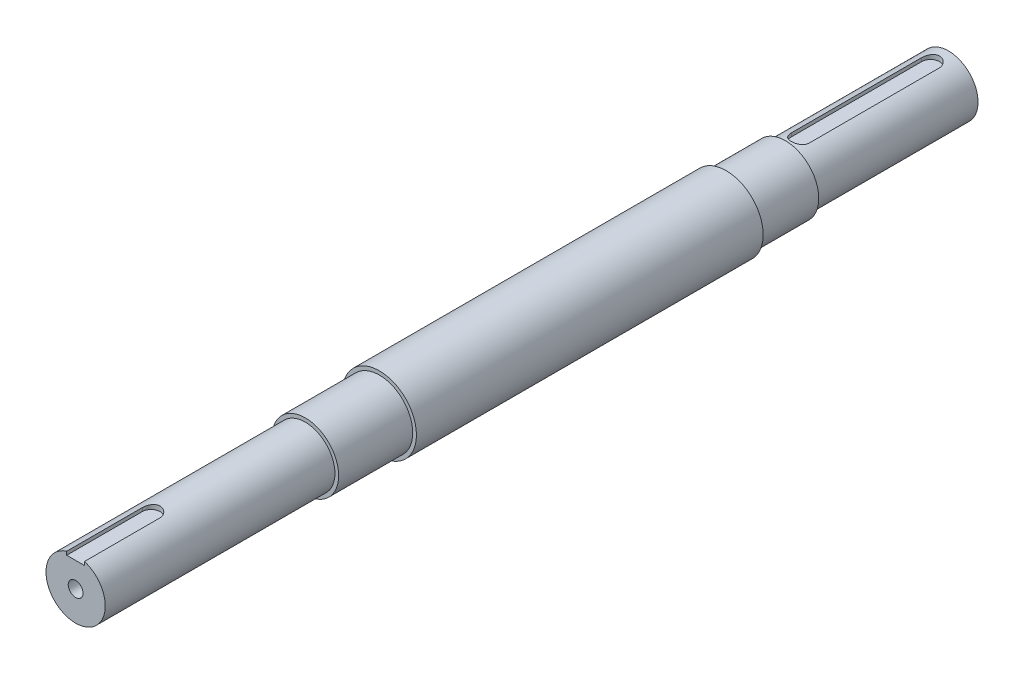
ISO-10303-21;
HEADER;
FILE_DESCRIPTION(('STEP AP214'),'2;1');
FILE_NAME('part.step','',(''),(''),'','','');
FILE_SCHEMA(('AUTOMOTIVE_DESIGN { 1 0 10303 214 1 1 1 1 }'));
ENDSEC;
DATA;
#1=APPLICATION_CONTEXT('core data for automotive mechanical design processes');
#2=APPLICATION_PROTOCOL_DEFINITION('international standard','automotive_design',2000,#1);
#3=PRODUCT_CONTEXT('',#1,'mechanical');
#4=PRODUCT('Part','Part','',(#3));
#5=PRODUCT_RELATED_PRODUCT_CATEGORY('part','',(#4));
#6=PRODUCT_DEFINITION_FORMATION('','',#4);
#7=PRODUCT_DEFINITION_CONTEXT('part definition',#1,'design');
#8=PRODUCT_DEFINITION('design','',#6,#7);
#9=PRODUCT_DEFINITION_SHAPE('','',#8);
#10=(LENGTH_UNIT() NAMED_UNIT(*) SI_UNIT(.MILLI.,.METRE.));
#11=(NAMED_UNIT(*) PLANE_ANGLE_UNIT() SI_UNIT($,.RADIAN.));
#12=(NAMED_UNIT(*) SI_UNIT($,.STERADIAN.) SOLID_ANGLE_UNIT());
#13=UNCERTAINTY_MEASURE_WITH_UNIT(LENGTH_MEASURE(1.E-05),#10,'distance_accuracy_value','');
#14=(GEOMETRIC_REPRESENTATION_CONTEXT(3) GLOBAL_UNCERTAINTY_ASSIGNED_CONTEXT((#13)) GLOBAL_UNIT_ASSIGNED_CONTEXT((#10,
#11,#12)) REPRESENTATION_CONTEXT('',''));
#15=CARTESIAN_POINT('',(0.,0.,0.));
#16=DIRECTION('',(0.,0.,1.));
#17=DIRECTION('',(1.,0.,0.));
#18=AXIS2_PLACEMENT_3D('',#15,#16,#17);
#19=CARTESIAN_POINT('',(0.,0.,234.));
#20=DIRECTION('',(0.,0.,-1.));
#21=DIRECTION('',(-1.,0.,0.));
#22=AXIS2_PLACEMENT_3D('',#19,#20,#21);
#23=CYLINDRICAL_SURFACE('',#22,25.);
#24=CARTESIAN_POINT('',(0.,0.,234.));
#25=DIRECTION('',(0.,0.,1.));
#26=DIRECTION('',(1.,0.,0.));
#27=AXIS2_PLACEMENT_3D('',#24,#25,#26);
#28=CIRCLE('',#27,25.);
#29=CARTESIAN_POINT('',(25.,0.,234.));
#30=VERTEX_POINT('',#29);
#31=EDGE_CURVE('E205',#30,#30,#28,.T.);
#32=ORIENTED_EDGE('',*,*,#31,.F.);
#33=EDGE_LOOP('',(#32));
#34=FACE_BOUND('',#33,.T.);
#35=CARTESIAN_POINT('',(0.,0.,0.));
#36=DIRECTION('',(0.,0.,1.));
#37=DIRECTION('',(1.,0.,0.));
#38=AXIS2_PLACEMENT_3D('',#35,#36,#37);
#39=CIRCLE('',#38,25.);
#40=CARTESIAN_POINT('',(25.,0.,0.));
#41=VERTEX_POINT('',#40);
#42=EDGE_CURVE('E202',#41,#41,#39,.T.);
#43=ORIENTED_EDGE('',*,*,#42,.T.);
#44=EDGE_LOOP('',(#43));
#45=FACE_BOUND('',#44,.T.);
#46=ADVANCED_FACE('F46',(#34,#45),#23,.T.);
#47=CARTESIAN_POINT('',(0.,0.,234.));
#48=DIRECTION('',(0.,0.,1.));
#49=DIRECTION('',(1.,0.,0.));
#50=AXIS2_PLACEMENT_3D('',#47,#48,#49);
#51=PLANE('',#50);
#52=CARTESIAN_POINT('',(0.,0.,234.));
#53=DIRECTION('',(0.,0.,1.));
#54=DIRECTION('',(1.,0.,0.));
#55=AXIS2_PLACEMENT_3D('',#52,#53,#54);
#56=CIRCLE('',#55,22.5);
#57=CARTESIAN_POINT('',(22.5,0.,234.));
#58=VERTEX_POINT('',#57);
#59=EDGE_CURVE('E187',#58,#58,#56,.T.);
#60=ORIENTED_EDGE('',*,*,#59,.F.);
#61=EDGE_LOOP('',(#60));
#62=FACE_BOUND('',#61,.T.);
#63=ORIENTED_EDGE('',*,*,#31,.T.);
#64=EDGE_LOOP('',(#63));
#65=FACE_BOUND('',#64,.T.);
#66=ADVANCED_FACE('F256',(#62,#65),#51,.T.);
#67=CARTESIAN_POINT('',(0.,0.,0.));
#68=DIRECTION('',(0.,0.,1.));
#69=DIRECTION('',(1.,0.,0.));
#70=AXIS2_PLACEMENT_3D('',#67,#68,#69);
#71=PLANE('',#70);
#72=CARTESIAN_POINT('',(0.,0.,0.));
#73=DIRECTION('',(0.,0.,-1.));
#74=DIRECTION('',(-1.,0.,0.));
#75=AXIS2_PLACEMENT_3D('',#72,#73,#74);
#76=CIRCLE('',#75,22.5);
#77=CARTESIAN_POINT('',(-22.5,0.,0.));
#78=VERTEX_POINT('',#77);
#79=EDGE_CURVE('E199',#78,#78,#76,.T.);
#80=ORIENTED_EDGE('',*,*,#79,.F.);
#81=EDGE_LOOP('',(#80));
#82=FACE_BOUND('',#81,.T.);
#83=ORIENTED_EDGE('',*,*,#42,.F.);
#84=EDGE_LOOP('',(#83));
#85=FACE_BOUND('',#84,.T.);
#86=ADVANCED_FACE('F261',(#82,#85),#71,.F.);
#87=CARTESIAN_POINT('',(0.,0.,-40.));
#88=DIRECTION('',(0.,0.,1.));
#89=DIRECTION('',(1.,0.,0.));
#90=AXIS2_PLACEMENT_3D('',#87,#88,#89);
#91=CYLINDRICAL_SURFACE('',#90,22.5);
#92=CARTESIAN_POINT('',(0.,0.,-40.));
#93=DIRECTION('',(0.,0.,-1.));
#94=DIRECTION('',(-1.,0.,0.));
#95=AXIS2_PLACEMENT_3D('',#92,#93,#94);
#96=CIRCLE('',#95,22.5);
#97=CARTESIAN_POINT('',(-22.5,0.,-40.));
#98=VERTEX_POINT('',#97);
#99=EDGE_CURVE('E196',#98,#98,#96,.T.);
#100=ORIENTED_EDGE('',*,*,#99,.F.);
#101=EDGE_LOOP('',(#100));
#102=FACE_BOUND('',#101,.T.);
#103=ORIENTED_EDGE('',*,*,#79,.T.);
#104=EDGE_LOOP('',(#103));
#105=FACE_BOUND('',#104,.T.);
#106=ADVANCED_FACE('F269',(#102,#105),#91,.T.);
#107=CARTESIAN_POINT('',(0.,0.,-40.));
#108=DIRECTION('',(0.,0.,-1.));
#109=DIRECTION('',(-1.,0.,0.));
#110=AXIS2_PLACEMENT_3D('',#107,#108,#109);
#111=PLANE('',#110);
#112=CARTESIAN_POINT('',(0.,0.,-40.));
#113=DIRECTION('',(0.,0.,-1.));
#114=DIRECTION('',(-1.,0.,0.));
#115=AXIS2_PLACEMENT_3D('',#112,#113,#114);
#116=CIRCLE('',#115,20.);
#117=CARTESIAN_POINT('',(-20.,0.,-40.));
#118=VERTEX_POINT('',#117);
#119=EDGE_CURVE('E193',#118,#118,#116,.T.);
#120=ORIENTED_EDGE('',*,*,#119,.F.);
#121=EDGE_LOOP('',(#120));
#122=FACE_BOUND('',#121,.T.);
#123=ORIENTED_EDGE('',*,*,#99,.T.);
#124=EDGE_LOOP('',(#123));
#125=FACE_BOUND('',#124,.T.);
#126=ADVANCED_FACE('F274',(#122,#125),#111,.T.);
#127=CARTESIAN_POINT('',(0.,0.,-150.));
#128=DIRECTION('',(0.,0.,1.));
#129=DIRECTION('',(1.,0.,0.));
#130=AXIS2_PLACEMENT_3D('',#127,#128,#129);
#131=CYLINDRICAL_SURFACE('',#130,20.);
#132=DIRECTION('',(0.,0.,1.));
#133=VECTOR('',#132,1.);
#134=CARTESIAN_POINT('',(6.,19.0787840283388,-150.));
#135=LINE('',#134,#133);
#136=CARTESIAN_POINT('',(6.,19.0787840283388,-138.));
#137=VERTEX_POINT('',#136);
#138=CARTESIAN_POINT('',(6.00000000000001,19.0787840283388,-50.));
#139=VERTEX_POINT('',#138);
#140=EDGE_CURVE('E13',#137,#139,#135,.T.);
#141=ORIENTED_EDGE('',*,*,#140,.T.);
#142=CARTESIAN_POINT('',(6.00000000000001,19.0787840283388,-50.));
#143=CARTESIAN_POINT('',(6.00002230630954,19.0787603919218,-49.8353320050892));
#144=CARTESIAN_POINT('',(5.99322212828862,19.0809150948053,-49.6706726130696));
#145=CARTESIAN_POINT('',(5.96614198358439,19.089408588524,-49.3426105716154));
#146=CARTESIAN_POINT('',(5.94586504749984,19.0957464386677,-49.1792076479863));
#147=CARTESIAN_POINT('',(5.8920645566866,19.1124126760414,-48.8552332063158));
#148=CARTESIAN_POINT('',(5.85857463708938,19.1227309292375,-48.6946555720362));
#149=CARTESIAN_POINT('',(5.77865096251379,19.1470349488515,-48.3770376913315));
#150=CARTESIAN_POINT('',(5.73221686903432,19.1610208111801,-48.2199975375307));
#151=CARTESIAN_POINT('',(5.62682620459485,19.1922338155173,-47.9106174392765));
#152=CARTESIAN_POINT('',(5.56787702452554,19.2094590438083,-47.7582747812241));
#153=CARTESIAN_POINT('',(5.43788252899625,19.2466621419291,-47.4591258570984));
#154=CARTESIAN_POINT('',(5.36683271334058,19.2666410353108,-47.3123216756719));
#155=CARTESIAN_POINT('',(5.21317247195195,19.3087849542851,-47.0252150547469));
#156=CARTESIAN_POINT('',(5.13056139609833,19.3309501027959,-46.8849129814703));
#157=CARTESIAN_POINT('',(4.95431913401974,19.3768680311909,-46.6116122013252));
#158=CARTESIAN_POINT('',(4.86068378223772,19.4006214097184,-46.4786162831277));
#159=CARTESIAN_POINT('',(4.66024014290224,19.4497584548899,-46.2171364267704));
#160=CARTESIAN_POINT('',(4.5531352636269,19.4751691904069,-46.0888848478018));
#161=CARTESIAN_POINT('',(4.32860344600267,19.5263015189751,-45.8417460629913));
#162=CARTESIAN_POINT('',(4.21117292654719,19.5520232171847,-45.7228621333289));
#163=CARTESIAN_POINT('',(3.96676059198593,19.6030710031715,-45.4952586048781));
#164=CARTESIAN_POINT('',(3.8397787187394,19.6283970885393,-45.3865390679712));
#165=CARTESIAN_POINT('',(3.57705696576212,19.6779706962222,-45.1799807455275));
#166=CARTESIAN_POINT('',(3.4413171551297,19.7022182270442,-45.082141874161));
#167=CARTESIAN_POINT('',(3.15899953964078,19.749471573422,-44.8960902317401));
#168=CARTESIAN_POINT('',(3.01225429870655,19.7724407517412,-44.8081219536975));
#169=CARTESIAN_POINT('',(2.71155717798054,19.8159158974823,-44.644936205945));
#170=CARTESIAN_POINT('',(2.55760798995098,19.8364227748921,-44.569714021433));
#171=CARTESIAN_POINT('',(2.24348996032484,19.8744001644265,-44.4325835606286));
#172=CARTESIAN_POINT('',(2.08331997555621,19.8918701152059,-44.3706777452318));
#173=CARTESIAN_POINT('',(1.75801430484775,19.923254535561,-44.2607624975442));
#174=CARTESIAN_POINT('',(1.5928807989739,19.9371705413064,-44.2127470600318));
#175=CARTESIAN_POINT('',(1.26354510595575,19.9607097696429,-44.1321744532723));
#176=CARTESIAN_POINT('',(1.0994480892508,19.9704430293701,-44.0992193730418));
#177=CARTESIAN_POINT('',(0.768952154148966,19.9858966495547,-44.0471280027136));
#178=CARTESIAN_POINT('',(0.60255418179931,19.9916186120195,-44.0279861958654));
#179=CARTESIAN_POINT('',(0.268644299740245,19.9988929276978,-44.0036800351431));
#180=CARTESIAN_POINT('',(0.101132356360992,20.0004451543012,-43.9985161056939));
#181=CARTESIAN_POINT('',(-0.233720900410843,19.9993350985709,-44.0022164050785));
#182=CARTESIAN_POINT('',(-0.401062216878486,19.9966728935832,-44.0110803764628));
#183=CARTESIAN_POINT('',(-0.72894994040029,19.9873626800315,-44.0422422116024));
#184=CARTESIAN_POINT('',(-0.889542117296633,19.9808452710305,-44.0641000099827));
#185=CARTESIAN_POINT('',(-1.20830021014904,19.9641050678088,-44.1206954817583));
#186=CARTESIAN_POINT('',(-1.36646528055413,19.9538810115069,-44.1554375422251));
#187=CARTESIAN_POINT('',(-1.67917461818936,19.9300014175933,-44.2374923016098));
#188=CARTESIAN_POINT('',(-1.83372008335729,19.916347033335,-44.2848007757229));
#189=CARTESIAN_POINT('',(-2.13828018933732,19.8859545815151,-44.3916302710632));
#190=CARTESIAN_POINT('',(-2.28829310223868,19.8692153547843,-44.4511558839967));
#191=CARTESIAN_POINT('',(-2.5844350788094,19.8328818557961,-44.5826905795393));
#192=CARTESIAN_POINT('',(-2.73050124822118,19.8132575095082,-44.6548328971983));
#193=CARTESIAN_POINT('',(-3.01609632375418,19.7717979578185,-44.8106231473294));
#194=CARTESIAN_POINT('',(-3.15562296424239,19.7499619943591,-44.8942750283841));
#195=CARTESIAN_POINT('',(-3.42724384686889,19.704643118031,-45.0724869824413));
#196=CARTESIAN_POINT('',(-3.55933800314024,19.6811601861419,-45.1670471814283));
#197=CARTESIAN_POINT('',(-3.81531376455354,19.6331439703208,-45.3664586784288));
#198=CARTESIAN_POINT('',(-3.93919513006482,19.6086106557753,-45.4713102765009));
#199=CARTESIAN_POINT('',(-4.18263653591651,19.5581593507452,-45.6948972434632));
#200=CARTESIAN_POINT('',(-4.30184428600932,19.5322244988475,-45.8140126794742));
#201=CARTESIAN_POINT('',(-4.52981041510265,19.4806179410542,-46.0618335035024));
#202=CARTESIAN_POINT('',(-4.63857214120813,19.454946153239,-46.1905357960809));
#203=CARTESIAN_POINT('',(-4.84504126060964,19.4045581786368,-46.4568403962384));
#204=CARTESIAN_POINT('',(-4.94274124635231,19.3798426394128,-46.5944485719006));
#205=CARTESIAN_POINT('',(-5.12628631686322,19.3321023379674,-46.8775590923328));
#206=CARTESIAN_POINT('',(-5.21213600998875,19.3090769201297,-47.0230583375784));
#207=CARTESIAN_POINT('',(-5.37223080367564,19.2651525602885,-47.3226351350932));
#208=CARTESIAN_POINT('',(-5.446343714374,19.2442786555291,-47.476787078659));
#209=CARTESIAN_POINT('',(-5.58122691640502,19.2055937237889,-47.7911218413611));
#210=CARTESIAN_POINT('',(-5.64200266456202,19.1877814448102,-47.9513021624776));
#211=CARTESIAN_POINT('',(-5.7496614534963,19.1557967477957,-48.2764321183499));
#212=CARTESIAN_POINT('',(-5.79655912825486,19.1416204978023,-48.4413765265628));
#213=CARTESIAN_POINT('',(-5.87609462586437,19.1173543231183,-48.774893180451));
#214=CARTESIAN_POINT('',(-5.90873902604376,19.1072625137754,-48.9434637150485));
#215=CARTESIAN_POINT('',(-5.956031317324,19.0925703406668,-49.2599370702365));
#216=CARTESIAN_POINT('',(-5.97251971262424,19.0874107715083,-49.40754170936));
#217=CARTESIAN_POINT('',(-5.99450261914155,19.0805126306352,-49.7034271124753));
#218=CARTESIAN_POINT('',(-6.00001329545507,19.0787690288453,-49.8517065595746));
#219=CARTESIAN_POINT('',(-5.99999999999999,19.0787840283388,-50.));
#220=B_SPLINE_CURVE_WITH_KNOTS('',3,(#142,#143,#144,#145,#146,#147,#148,#149,#150,#151,#152,
#153,#154,#155,#156,#157,#158,#159,#160,#161,#162,#163,#164,#165,#166,#167,#168,#169,#170,#171,
#172,#173,#174,#175,#176,#177,#178,#179,#180,#181,#182,#183,#184,#185,#186,#187,#188,#189,#190,
#191,#192,#193,#194,#195,#196,#197,#198,#199,#200,#201,#202,#203,#204,#205,#206,#207,#208,#209,
#210,#211,#212,#213,#214,#215,#216,#217,#218,#219),.UNSPECIFIED.,.F.,.F.,(4,2,2,2,2,2,2,2,2,2,2,
2,2,2,2,2,2,2,2,2,2,2,2,2,2,2,2,2,2,2,2,2,2,2,2,2,2,2,4),(0.,0.493836284878935,
0.987561555412167,1.48003801924603,1.97252736296405,2.4647266679518,2.95710942192587,
3.44951987503683,3.94211698773001,4.44857898474592,4.95521732942466,5.46185875834845,
5.96849619046394,6.48574341264193,7.00279888450883,7.51994982748058,8.03687685551443,
8.53921958328377,9.04136157401788,9.54351881163819,10.0456668334346,10.5317065218739,
11.0179118582603,11.5039539397551,11.9901790315928,12.4818885441265,12.9737671698834,
13.4656514771114,13.9575501300996,14.4684682486942,14.9792221093922,15.4903160010787,
16.001210574562,16.517502934493,17.0335836608614,17.549118241575,18.0644146711719,
18.509813123396,18.9545552237083),.UNSPECIFIED.);
#221=CARTESIAN_POINT('',(-5.99999999999999,19.0787840283388,-50.));
#222=VERTEX_POINT('',#221);
#223=EDGE_CURVE('E221',#139,#222,#220,.T.);
#224=ORIENTED_EDGE('',*,*,#223,.T.);
#225=DIRECTION('',(0.,0.,1.));
#226=VECTOR('',#225,1.);
#227=CARTESIAN_POINT('',(-6.,19.0787840283388,-150.));
#228=LINE('',#227,#226);
#229=CARTESIAN_POINT('',(-6.,19.0787840283388,-138.));
#230=VERTEX_POINT('',#229);
#231=EDGE_CURVE('E53',#222,#230,#228,.F.);
#232=ORIENTED_EDGE('',*,*,#231,.T.);
#233=CARTESIAN_POINT('',(-6.,19.0787840283388,-138.));
#234=CARTESIAN_POINT('',(-6.00002230630954,19.0787603919218,-138.164667994911));
#235=CARTESIAN_POINT('',(-5.99322212828861,19.0809150948054,-138.32932738693));
#236=CARTESIAN_POINT('',(-5.96614198358438,19.089408588524,-138.657389428385));
#237=CARTESIAN_POINT('',(-5.94586504749982,19.0957464386677,-138.820792352014));
#238=CARTESIAN_POINT('',(-5.89206455668658,19.1124126760415,-139.144766793684));
#239=CARTESIAN_POINT('',(-5.85857463708937,19.1227309292375,-139.305344427964));
#240=CARTESIAN_POINT('',(-5.77865096251377,19.1470349488515,-139.622962308668));
#241=CARTESIAN_POINT('',(-5.73221686903431,19.1610208111801,-139.780002462469));
#242=CARTESIAN_POINT('',(-5.62682620459483,19.1922338155173,-140.089382560724));
#243=CARTESIAN_POINT('',(-5.56787702452552,19.2094590438083,-140.241725218776));
#244=CARTESIAN_POINT('',(-5.43788252899623,19.2466621419291,-140.540874142902));
#245=CARTESIAN_POINT('',(-5.36683271334056,19.2666410353108,-140.687678324328));
#246=CARTESIAN_POINT('',(-5.21317247195194,19.3087849542851,-140.974784945253));
#247=CARTESIAN_POINT('',(-5.13056139609832,19.3309501027959,-141.11508701853));
#248=CARTESIAN_POINT('',(-4.95431913401973,19.3768680311909,-141.388387798675));
#249=CARTESIAN_POINT('',(-4.86068378223771,19.4006214097184,-141.521383716872));
#250=CARTESIAN_POINT('',(-4.66024014290224,19.4497584548899,-141.78286357323));
#251=CARTESIAN_POINT('',(-4.5531352636269,19.4751691904069,-141.911115152198));
#252=CARTESIAN_POINT('',(-4.32860344600267,19.5263015189751,-142.158253937009));
#253=CARTESIAN_POINT('',(-4.21117292654719,19.5520232171847,-142.277137866671));
#254=CARTESIAN_POINT('',(-3.96676059198593,19.6030710031715,-142.504741395122));
#255=CARTESIAN_POINT('',(-3.8397787187394,19.6283970885393,-142.613460932029));
#256=CARTESIAN_POINT('',(-3.57705696576211,19.6779706962222,-142.820019254472));
#257=CARTESIAN_POINT('',(-3.44131715512969,19.7022182270442,-142.917858125839));
#258=CARTESIAN_POINT('',(-3.15899953964076,19.749471573422,-143.10390976826));
#259=CARTESIAN_POINT('',(-3.01225429870653,19.7724407517412,-143.191878046302));
#260=CARTESIAN_POINT('',(-2.71155717798052,19.8159158974823,-143.355063794055));
#261=CARTESIAN_POINT('',(-2.55760798995096,19.8364227748921,-143.430285978567));
#262=CARTESIAN_POINT('',(-2.24348996032481,19.8744001644265,-143.567416439371));
#263=CARTESIAN_POINT('',(-2.08331997555618,19.8918701152059,-143.629322254768));
#264=CARTESIAN_POINT('',(-1.75801430484772,19.9232545355611,-143.739237502456));
#265=CARTESIAN_POINT('',(-1.59288079897389,19.9371705413067,-143.787252939968));
#266=CARTESIAN_POINT('',(-1.26354510595574,19.9607097696431,-143.867825546728));
#267=CARTESIAN_POINT('',(-1.09944808925078,19.9704430293702,-143.900780626958));
#268=CARTESIAN_POINT('',(-0.768952154148942,19.9858966495547,-143.952871997286));
#269=CARTESIAN_POINT('',(-0.60255418179929,19.9916186120195,-143.972013804135));
#270=CARTESIAN_POINT('',(-0.268644299740226,19.9988929276978,-143.996319964857));
#271=CARTESIAN_POINT('',(-0.10113235636097,20.0004451543012,-144.001483894306));
#272=CARTESIAN_POINT('',(0.233720900410867,19.9993350985709,-143.997783594921));
#273=CARTESIAN_POINT('',(0.40106221687851,19.9966728935832,-143.988919623537));
#274=CARTESIAN_POINT('',(0.728949940400316,19.9873626800315,-143.957757788398));
#275=CARTESIAN_POINT('',(0.889542117296662,19.9808452710305,-143.935899990017));
#276=CARTESIAN_POINT('',(1.20830021014907,19.9641050678088,-143.879304518242));
#277=CARTESIAN_POINT('',(1.36646528055415,19.9538810115069,-143.844562457775));
#278=CARTESIAN_POINT('',(1.67917461818938,19.9300014175933,-143.76250769839));
#279=CARTESIAN_POINT('',(1.83372008335732,19.9163470333349,-143.715199224277));
#280=CARTESIAN_POINT('',(2.13828018933735,19.8859545815151,-143.608369728937));
#281=CARTESIAN_POINT('',(2.28829310223871,19.8692153547843,-143.548844116003));
#282=CARTESIAN_POINT('',(2.58443507880942,19.8328818557961,-143.417309420461));
#283=CARTESIAN_POINT('',(2.7305012482212,19.8132575095082,-143.345167102802));
#284=CARTESIAN_POINT('',(3.0160963237542,19.7717979578185,-143.189376852671));
#285=CARTESIAN_POINT('',(3.15562296424241,19.7499619943591,-143.105724971616));
#286=CARTESIAN_POINT('',(3.42724384686891,19.704643118031,-142.927513017559));
#287=CARTESIAN_POINT('',(3.55933800314026,19.6811601861419,-142.832952818572));
#288=CARTESIAN_POINT('',(3.81531376455355,19.6331439703208,-142.633541321571));
#289=CARTESIAN_POINT('',(3.93919513006484,19.6086106557753,-142.528689723499));
#290=CARTESIAN_POINT('',(4.18263653591652,19.5581593507452,-142.305102756537));
#291=CARTESIAN_POINT('',(4.30184428600934,19.5322244988475,-142.185987320526));
#292=CARTESIAN_POINT('',(4.52981041510267,19.4806179410542,-141.938166496498));
#293=CARTESIAN_POINT('',(4.63857214120815,19.454946153239,-141.809464203919));
#294=CARTESIAN_POINT('',(4.84504126060965,19.4045581786368,-141.543159603762));
#295=CARTESIAN_POINT('',(4.94274124635232,19.3798426394128,-141.405551428099));
#296=CARTESIAN_POINT('',(5.12628631686323,19.3321023379674,-141.122440907667));
#297=CARTESIAN_POINT('',(5.21213600998877,19.3090769201297,-140.976941662422));
#298=CARTESIAN_POINT('',(5.37223080367565,19.2651525602885,-140.677364864907));
#299=CARTESIAN_POINT('',(5.44634371437402,19.2442786555291,-140.523212921341));
#300=CARTESIAN_POINT('',(5.58122691640503,19.2055937237889,-140.208878158639));
#301=CARTESIAN_POINT('',(5.64200266456203,19.1877814448102,-140.048697837522));
#302=CARTESIAN_POINT('',(5.74966145349631,19.1557967477957,-139.72356788165));
#303=CARTESIAN_POINT('',(5.79655912825487,19.1416204978023,-139.558623473437));
#304=CARTESIAN_POINT('',(5.87609462586438,19.1173543231183,-139.225106819549));
#305=CARTESIAN_POINT('',(5.90873902604377,19.1072625137754,-139.056536284951));
#306=CARTESIAN_POINT('',(5.95603131732401,19.0925703406668,-138.740062929764));
#307=CARTESIAN_POINT('',(5.97251971262425,19.0874107715083,-138.59245829064));
#308=CARTESIAN_POINT('',(5.99450261914155,19.0805126306352,-138.296572887525));
#309=CARTESIAN_POINT('',(6.00001329545508,19.0787690288453,-138.148293440425));
#310=CARTESIAN_POINT('',(6.,19.0787840283388,-138.));
#311=B_SPLINE_CURVE_WITH_KNOTS('',3,(#233,#234,#235,#236,#237,#238,#239,#240,#241,#242,#243,
#244,#245,#246,#247,#248,#249,#250,#251,#252,#253,#254,#255,#256,#257,#258,#259,#260,#261,#262,
#263,#264,#265,#266,#267,#268,#269,#270,#271,#272,#273,#274,#275,#276,#277,#278,#279,#280,#281,
#282,#283,#284,#285,#286,#287,#288,#289,#290,#291,#292,#293,#294,#295,#296,#297,#298,#299,#300,
#301,#302,#303,#304,#305,#306,#307,#308,#309,#310),.UNSPECIFIED.,.F.,.F.,(4,2,2,2,2,2,2,2,2,2,2,
2,2,2,2,2,2,2,2,2,2,2,2,2,2,2,2,2,2,2,2,2,2,2,2,2,2,2,4),(0.,0.493836284878977,
0.987561555412217,1.48003801924605,1.97252736296405,2.46472666795184,2.95710942192589,
3.44951987503686,3.94211698773,4.44857898474589,4.95521732942464,5.46185875834845,
5.96849619046394,6.48574341264194,7.00279888450884,7.5199498274806,8.03687685551446,
8.53921958328379,9.04136157401789,9.54351881163821,10.0456668334346,10.531706521874,
11.0179118582603,11.5039539397552,11.9901790315928,12.4818885441265,12.9737671698834,
13.4656514771114,13.9575501300996,14.4684682486943,14.9792221093922,15.4903160010787,
16.001210574562,16.5175029344931,17.0335836608614,17.549118241575,18.0644146711719,
18.509813123396,18.9545552237083),.UNSPECIFIED.);
#312=EDGE_CURVE('E60',#230,#137,#311,.T.);
#313=ORIENTED_EDGE('',*,*,#312,.T.);
#314=EDGE_LOOP('',(#141,#224,#232,#313));
#315=FACE_BOUND('',#314,.T.);
#316=CARTESIAN_POINT('',(0.,0.,-150.));
#317=DIRECTION('',(0.,0.,-1.));
#318=DIRECTION('',(-1.,0.,0.));
#319=AXIS2_PLACEMENT_3D('',#316,#317,#318);
#320=CIRCLE('',#319,20.);
#321=CARTESIAN_POINT('',(-20.,0.,-150.));
#322=VERTEX_POINT('',#321);
#323=EDGE_CURVE('E190',#322,#322,#320,.T.);
#324=ORIENTED_EDGE('',*,*,#323,.F.);
#325=EDGE_LOOP('',(#324));
#326=FACE_BOUND('',#325,.T.);
#327=ORIENTED_EDGE('',*,*,#119,.T.);
#328=EDGE_LOOP('',(#327));
#329=FACE_BOUND('',#328,.T.);
#330=ADVANCED_FACE('F280',(#315,#326,#329),#131,.T.);
#331=CARTESIAN_POINT('',(0.,0.,-150.));
#332=DIRECTION('',(0.,0.,-1.));
#333=DIRECTION('',(-1.,0.,0.));
#334=AXIS2_PLACEMENT_3D('',#331,#332,#333);
#335=PLANE('',#334);
#336=CARTESIAN_POINT('',(0.,0.,-150.));
#337=DIRECTION('',(0.,0.,-1.));
#338=DIRECTION('',(-1.,0.,0.));
#339=AXIS2_PLACEMENT_3D('',#336,#337,#338);
#340=CIRCLE('',#339,4.99999999999999);
#341=CARTESIAN_POINT('',(-4.99999999999999,0.,-150.));
#342=VERTEX_POINT('',#341);
#343=EDGE_CURVE('E124',#342,#342,#340,.T.);
#344=ORIENTED_EDGE('',*,*,#343,.F.);
#345=EDGE_LOOP('',(#344));
#346=FACE_BOUND('',#345,.T.);
#347=ORIENTED_EDGE('',*,*,#323,.T.);
#348=EDGE_LOOP('',(#347));
#349=FACE_BOUND('',#348,.T.);
#350=ADVANCED_FACE('F285',(#346,#349),#335,.T.);
#351=CARTESIAN_POINT('',(0.,0.,284.));
#352=DIRECTION('',(0.,0.,-1.));
#353=DIRECTION('',(-1.,0.,0.));
#354=AXIS2_PLACEMENT_3D('',#351,#352,#353);
#355=CYLINDRICAL_SURFACE('',#354,22.5);
#356=CARTESIAN_POINT('',(0.,0.,284.));
#357=DIRECTION('',(0.,0.,1.));
#358=DIRECTION('',(1.,0.,0.));
#359=AXIS2_PLACEMENT_3D('',#356,#357,#358);
#360=CIRCLE('',#359,22.5);
#361=CARTESIAN_POINT('',(22.5,0.,284.));
#362=VERTEX_POINT('',#361);
#363=EDGE_CURVE('E182',#362,#362,#360,.T.);
#364=ORIENTED_EDGE('',*,*,#363,.F.);
#365=EDGE_LOOP('',(#364));
#366=FACE_BOUND('',#365,.T.);
#367=ORIENTED_EDGE('',*,*,#59,.T.);
#368=EDGE_LOOP('',(#367));
#369=FACE_BOUND('',#368,.T.);
#370=ADVANCED_FACE('F385',(#366,#369),#355,.T.);
#371=CARTESIAN_POINT('',(0.,0.,284.));
#372=DIRECTION('',(0.,0.,1.));
#373=DIRECTION('',(1.,0.,0.));
#374=AXIS2_PLACEMENT_3D('',#371,#372,#373);
#375=PLANE('',#374);
#376=CARTESIAN_POINT('',(0.,0.,284.));
#377=DIRECTION('',(0.,0.,1.));
#378=DIRECTION('',(1.,0.,0.));
#379=AXIS2_PLACEMENT_3D('',#376,#377,#378);
#380=CIRCLE('',#379,20.);
#381=CARTESIAN_POINT('',(20.,0.,284.));
#382=VERTEX_POINT('',#381);
#383=EDGE_CURVE('E183',#382,#382,#380,.T.);
#384=ORIENTED_EDGE('',*,*,#383,.F.);
#385=EDGE_LOOP('',(#384));
#386=FACE_BOUND('',#385,.T.);
#387=ORIENTED_EDGE('',*,*,#363,.T.);
#388=EDGE_LOOP('',(#387));
#389=FACE_BOUND('',#388,.T.);
#390=ADVANCED_FACE('F251',(#386,#389),#375,.T.);
#391=CARTESIAN_POINT('',(0.,0.,439.));
#392=DIRECTION('',(0.,0.,-1.));
#393=DIRECTION('',(-1.,0.,0.));
#394=AXIS2_PLACEMENT_3D('',#391,#392,#393);
#395=CYLINDRICAL_SURFACE('',#394,20.);
#396=CARTESIAN_POINT('',(0.,0.,439.));
#397=DIRECTION('',(0.,0.,1.));
#398=DIRECTION('',(1.,0.,0.));
#399=AXIS2_PLACEMENT_3D('',#396,#397,#398);
#400=CIRCLE('',#399,20.);
#401=CARTESIAN_POINT('',(-6.,19.0787840283388,439.));
#402=VERTEX_POINT('',#401);
#403=CARTESIAN_POINT('',(6.,19.0787840283388,439.));
#404=VERTEX_POINT('',#403);
#405=EDGE_CURVE('E179',#402,#404,#400,.T.);
#406=ORIENTED_EDGE('',*,*,#405,.F.);
#407=DIRECTION('',(0.,0.,-1.));
#408=VECTOR('',#407,1.);
#409=CARTESIAN_POINT('',(-6.,19.0787840283388,439.));
#410=LINE('',#409,#408);
#411=CARTESIAN_POINT('',(-6.,19.0787840283388,388.));
#412=VERTEX_POINT('',#411);
#413=EDGE_CURVE('E176',#402,#412,#410,.T.);
#414=ORIENTED_EDGE('',*,*,#413,.T.);
#415=CARTESIAN_POINT('',(-6.,19.0787840283388,388.));
#416=CARTESIAN_POINT('',(-6.00002230630954,19.0787603919218,387.835332005089));
#417=CARTESIAN_POINT('',(-5.99322212828861,19.0809150948053,387.67067261307));
#418=CARTESIAN_POINT('',(-5.96614198358439,19.089408588524,387.342610571616));
#419=CARTESIAN_POINT('',(-5.94586504749983,19.0957464386677,387.179207647986));
#420=CARTESIAN_POINT('',(-5.89206455668659,19.1124126760414,386.855233206316));
#421=CARTESIAN_POINT('',(-5.85857463708937,19.1227309292375,386.694655572036));
#422=CARTESIAN_POINT('',(-5.77865096251378,19.1470349488515,386.377037691332));
#423=CARTESIAN_POINT('',(-5.73221686903432,19.1610208111801,386.219997537531));
#424=CARTESIAN_POINT('',(-5.62682620459485,19.1922338155173,385.910617439277));
#425=CARTESIAN_POINT('',(-5.56787702452554,19.2094590438083,385.758274781224));
#426=CARTESIAN_POINT('',(-5.43788252899627,19.2466621419291,385.459125857099));
#427=CARTESIAN_POINT('',(-5.36683271334059,19.2666410353108,385.312321675672));
#428=CARTESIAN_POINT('',(-5.21317247195197,19.3087849542851,385.025215054747));
#429=CARTESIAN_POINT('',(-5.13056139609835,19.3309501027959,384.88491298147));
#430=CARTESIAN_POINT('',(-4.95431913401975,19.3768680311909,384.611612201325));
#431=CARTESIAN_POINT('',(-4.86068378223773,19.4006214097184,384.478616283128));
#432=CARTESIAN_POINT('',(-4.66024014290223,19.4497584548899,384.21713642677));
#433=CARTESIAN_POINT('',(-4.55313526362689,19.4751691904069,384.088884847802));
#434=CARTESIAN_POINT('',(-4.32860344600265,19.5263015189751,383.841746062991));
#435=CARTESIAN_POINT('',(-4.21117292654718,19.5520232171847,383.722862133329));
#436=CARTESIAN_POINT('',(-3.96676059198592,19.6030710031715,383.495258604878));
#437=CARTESIAN_POINT('',(-3.83977871873939,19.6283970885393,383.386539067971));
#438=CARTESIAN_POINT('',(-3.57705696576211,19.6779706962222,383.179980745528));
#439=CARTESIAN_POINT('',(-3.4413171551297,19.7022182270442,383.082141874161));
#440=CARTESIAN_POINT('',(-3.15899953964078,19.749471573422,382.89609023174));
#441=CARTESIAN_POINT('',(-3.01225429870655,19.7724407517412,382.808121953698));
#442=CARTESIAN_POINT('',(-2.71155717798054,19.8159158974823,382.644936205945));
#443=CARTESIAN_POINT('',(-2.55760798995098,19.8364227748921,382.569714021433));
#444=CARTESIAN_POINT('',(-2.24348996032483,19.8744001644265,382.432583560629));
#445=CARTESIAN_POINT('',(-2.0833199755562,19.8918701152059,382.370677745232));
#446=CARTESIAN_POINT('',(-1.75801430484774,19.923254535561,382.260762497544));
#447=CARTESIAN_POINT('',(-1.5928807989739,19.9371705413064,382.212747060032));
#448=CARTESIAN_POINT('',(-1.26354510595575,19.9607097696429,382.132174453272));
#449=CARTESIAN_POINT('',(-1.09944808925079,19.9704430293701,382.099219373042));
#450=CARTESIAN_POINT('',(-0.768952154148962,19.9858966495547,382.047128002714));
#451=CARTESIAN_POINT('',(-0.602554181799306,19.9916186120195,382.027986195865));
#452=CARTESIAN_POINT('',(-0.268644299740244,19.9988929276978,382.003680035143));
#453=CARTESIAN_POINT('',(-0.101132356360993,20.0004451543012,381.998516105694));
#454=CARTESIAN_POINT('',(0.233720900410838,19.9993350985709,382.002216405079));
#455=CARTESIAN_POINT('',(0.40106221687848,19.9966728935832,382.011080376463));
#456=CARTESIAN_POINT('',(0.728949940400284,19.9873626800315,382.042242211603));
#457=CARTESIAN_POINT('',(0.88954211729663,19.9808452710305,382.064100009983));
#458=CARTESIAN_POINT('',(1.20830021014903,19.9641050678088,382.120695481758));
#459=CARTESIAN_POINT('',(1.36646528055412,19.9538810115069,382.155437542225));
#460=CARTESIAN_POINT('',(1.67917461818934,19.9300014175933,382.23749230161));
#461=CARTESIAN_POINT('',(1.83372008335727,19.916347033335,382.284800775723));
#462=CARTESIAN_POINT('',(2.1382801893373,19.8859545815151,382.391630271063));
#463=CARTESIAN_POINT('',(2.28829310223867,19.8692153547843,382.451155883997));
#464=CARTESIAN_POINT('',(2.58443507880938,19.8328818557961,382.582690579539));
#465=CARTESIAN_POINT('',(2.73050124822115,19.8132575095082,382.654832897198));
#466=CARTESIAN_POINT('',(3.01609632375415,19.7717979578185,382.81062314733));
#467=CARTESIAN_POINT('',(3.15562296424237,19.7499619943591,382.894275028384));
#468=CARTESIAN_POINT('',(3.42724384686888,19.704643118031,383.072486982441));
#469=CARTESIAN_POINT('',(3.55933800314023,19.6811601861419,383.167047181428));
#470=CARTESIAN_POINT('',(3.81531376455352,19.6331439703208,383.366458678429));
#471=CARTESIAN_POINT('',(3.93919513006481,19.6086106557753,383.471310276501));
#472=CARTESIAN_POINT('',(4.1826365359165,19.5581593507452,383.694897243463));
#473=CARTESIAN_POINT('',(4.30184428600932,19.5322244988475,383.814012679474));
#474=CARTESIAN_POINT('',(4.52981041510265,19.4806179410542,384.061833503502));
#475=CARTESIAN_POINT('',(4.63857214120814,19.454946153239,384.190535796081));
#476=CARTESIAN_POINT('',(4.84504126060964,19.4045581786368,384.456840396239));
#477=CARTESIAN_POINT('',(4.94274124635231,19.3798426394128,384.594448571901));
#478=CARTESIAN_POINT('',(5.12628631686323,19.3321023379674,384.877559092333));
#479=CARTESIAN_POINT('',(5.21213600998877,19.3090769201297,385.023058337579));
#480=CARTESIAN_POINT('',(5.37223080367565,19.2651525602885,385.322635135093));
#481=CARTESIAN_POINT('',(5.44634371437401,19.2442786555291,385.476787078659));
#482=CARTESIAN_POINT('',(5.58122691640502,19.2055937237889,385.791121841361));
#483=CARTESIAN_POINT('',(5.64200266456202,19.1877814448102,385.951302162478));
#484=CARTESIAN_POINT('',(5.74966145349631,19.1557967477957,386.27643211835));
#485=CARTESIAN_POINT('',(5.79655912825487,19.1416204978023,386.441376526563));
#486=CARTESIAN_POINT('',(5.87609462586438,19.1173543231183,386.774893180451));
#487=CARTESIAN_POINT('',(5.90873902604377,19.1072625137754,386.943463715049));
#488=CARTESIAN_POINT('',(5.956031317324,19.0925703406668,387.259937070237));
#489=CARTESIAN_POINT('',(5.97251971262425,19.0874107715083,387.40754170936));
#490=CARTESIAN_POINT('',(5.99450261914155,19.0805126306352,387.703427112475));
#491=CARTESIAN_POINT('',(6.00001329545508,19.0787690288453,387.851706559575));
#492=CARTESIAN_POINT('',(6.,19.0787840283388,388.));
#493=B_SPLINE_CURVE_WITH_KNOTS('',3,(#415,#416,#417,#418,#419,#420,#421,#422,#423,#424,#425,
#426,#427,#428,#429,#430,#431,#432,#433,#434,#435,#436,#437,#438,#439,#440,#441,#442,#443,#444,
#445,#446,#447,#448,#449,#450,#451,#452,#453,#454,#455,#456,#457,#458,#459,#460,#461,#462,#463,
#464,#465,#466,#467,#468,#469,#470,#471,#472,#473,#474,#475,#476,#477,#478,#479,#480,#481,#482,
#483,#484,#485,#486,#487,#488,#489,#490,#491,#492),.UNSPECIFIED.,.F.,.F.,(4,2,2,2,2,2,2,2,2,2,2,
2,2,2,2,2,2,2,2,2,2,2,2,2,2,2,2,2,2,2,2,2,2,2,2,2,2,2,4),(0.,0.493836284878949,0.98756155541216,
1.48003801924603,1.97252736296403,2.46472666795175,2.95710942192583,3.44951987503679,
3.94211698773,4.44857898474595,4.95521732942467,5.46185875834844,5.96849619046393,
6.48574341264192,7.00279888450883,7.51994982748059,8.03687685551443,8.53921958328377,
9.04136157401788,9.54351881163818,10.0456668334346,10.5317065218739,11.0179118582603,
11.5039539397551,11.9901790315928,12.4818885441265,12.9737671698834,13.4656514771114,
13.9575501300995,14.4684682486942,14.9792221093922,15.4903160010786,16.001210574562,
16.517502934493,17.0335836608614,17.5491182415751,18.0644146711719,18.509813123396,
18.9545552237083),.UNSPECIFIED.);
#494=CARTESIAN_POINT('',(6.,19.0787840283388,388.));
#495=VERTEX_POINT('',#494);
#496=EDGE_CURVE('E212',#412,#495,#493,.T.);
#497=ORIENTED_EDGE('',*,*,#496,.T.);
#498=DIRECTION('',(0.,0.,-1.));
#499=VECTOR('',#498,1.);
#500=CARTESIAN_POINT('',(6.,19.0787840283388,439.));
#501=LINE('',#500,#499);
#502=EDGE_CURVE('E166',#495,#404,#501,.F.);
#503=ORIENTED_EDGE('',*,*,#502,.T.);
#504=EDGE_LOOP('',(#406,#414,#497,#503));
#505=FACE_BOUND('',#504,.T.);
#506=ORIENTED_EDGE('',*,*,#383,.T.);
#507=EDGE_LOOP('',(#506));
#508=FACE_BOUND('',#507,.T.);
#509=ADVANCED_FACE('F229',(#505,#508),#395,.T.);
#510=CARTESIAN_POINT('',(0.,0.,439.));
#511=DIRECTION('',(0.,0.,1.));
#512=DIRECTION('',(1.,0.,0.));
#513=AXIS2_PLACEMENT_3D('',#510,#511,#512);
#514=PLANE('',#513);
#515=CARTESIAN_POINT('',(0.,0.,439.));
#516=DIRECTION('',(0.,0.,1.));
#517=DIRECTION('',(1.,0.,0.));
#518=AXIS2_PLACEMENT_3D('',#515,#516,#517);
#519=CIRCLE('',#518,5.);
#520=CARTESIAN_POINT('',(5.,0.,439.));
#521=VERTEX_POINT('',#520);
#522=EDGE_CURVE('E143',#521,#521,#519,.T.);
#523=ORIENTED_EDGE('',*,*,#522,.F.);
#524=EDGE_LOOP('',(#523));
#525=FACE_BOUND('',#524,.T.);
#526=DIRECTION('',(0.,1.,0.));
#527=VECTOR('',#526,1.);
#528=CARTESIAN_POINT('',(-6.,16.6999999999999,439.));
#529=LINE('',#528,#527);
#530=CARTESIAN_POINT('',(-6.,16.6999999999999,439.));
#531=VERTEX_POINT('',#530);
#532=EDGE_CURVE('E163',#531,#402,#529,.T.);
#533=ORIENTED_EDGE('',*,*,#532,.T.);
#534=ORIENTED_EDGE('',*,*,#405,.T.);
#535=DIRECTION('',(0.,1.,0.));
#536=VECTOR('',#535,1.);
#537=CARTESIAN_POINT('',(6.,16.6999999999999,439.));
#538=LINE('',#537,#536);
#539=CARTESIAN_POINT('',(6.,16.6999999999999,439.));
#540=VERTEX_POINT('',#539);
#541=EDGE_CURVE('E162',#540,#404,#538,.T.);
#542=ORIENTED_EDGE('',*,*,#541,.F.);
#543=DIRECTION('',(-1.,0.,0.));
#544=VECTOR('',#543,1.);
#545=CARTESIAN_POINT('',(0.,16.6999999999999,439.));
#546=LINE('',#545,#544);
#547=EDGE_CURVE('E186',#540,#531,#546,.T.);
#548=ORIENTED_EDGE('',*,*,#547,.T.);
#549=EDGE_LOOP('',(#533,#534,#542,#548));
#550=FACE_BOUND('',#549,.T.);
#551=ADVANCED_FACE('F239',(#525,#550),#514,.T.);
#552=CARTESIAN_POINT('',(0.,16.6999999999999,388.));
#553=DIRECTION('',(0.,1.,0.));
#554=DIRECTION('',(0.,0.,1.));
#555=AXIS2_PLACEMENT_3D('',#552,#553,#554);
#556=CYLINDRICAL_SURFACE('',#555,6.);
#557=DIRECTION('',(0.,1.,0.));
#558=VECTOR('',#557,1.);
#559=CARTESIAN_POINT('',(-6.,16.6999999999999,388.));
#560=LINE('',#559,#558);
#561=CARTESIAN_POINT('',(-6.,16.6999999999999,388.));
#562=VERTEX_POINT('',#561);
#563=EDGE_CURVE('E167',#562,#412,#560,.T.);
#564=ORIENTED_EDGE('',*,*,#563,.F.);
#565=CARTESIAN_POINT('',(0.,16.6999999999999,388.));
#566=DIRECTION('',(0.,1.,0.));
#567=DIRECTION('',(0.,0.,1.));
#568=AXIS2_PLACEMENT_3D('',#565,#566,#567);
#569=CIRCLE('',#568,6.);
#570=CARTESIAN_POINT('',(6.,16.6999999999999,388.));
#571=VERTEX_POINT('',#570);
#572=EDGE_CURVE('E159',#571,#562,#569,.T.);
#573=ORIENTED_EDGE('',*,*,#572,.F.);
#574=DIRECTION('',(0.,1.,0.));
#575=VECTOR('',#574,1.);
#576=CARTESIAN_POINT('',(6.,16.6999999999999,388.));
#577=LINE('',#576,#575);
#578=EDGE_CURVE('E170',#571,#495,#577,.T.);
#579=ORIENTED_EDGE('',*,*,#578,.T.);
#580=ORIENTED_EDGE('',*,*,#496,.F.);
#581=EDGE_LOOP('',(#564,#573,#579,#580));
#582=FACE_BOUND('',#581,.T.);
#583=ADVANCED_FACE('F233',(#582),#556,.F.);
#584=CARTESIAN_POINT('',(-6.,16.6999999999999,439.));
#585=DIRECTION('',(-1.,0.,0.));
#586=DIRECTION('',(0.,0.,1.));
#587=AXIS2_PLACEMENT_3D('',#584,#585,#586);
#588=PLANE('',#587);
#589=ORIENTED_EDGE('',*,*,#532,.F.);
#590=DIRECTION('',(0.,0.,1.));
#591=VECTOR('',#590,1.);
#592=CARTESIAN_POINT('',(-6.,16.6999999999999,439.));
#593=LINE('',#592,#591);
#594=EDGE_CURVE('E68',#562,#531,#593,.T.);
#595=ORIENTED_EDGE('',*,*,#594,.F.);
#596=ORIENTED_EDGE('',*,*,#563,.T.);
#597=ORIENTED_EDGE('',*,*,#413,.F.);
#598=EDGE_LOOP('',(#589,#595,#596,#597));
#599=FACE_BOUND('',#598,.T.);
#600=ADVANCED_FACE('F238',(#599),#588,.F.);
#601=CARTESIAN_POINT('',(6.,16.6999999999999,439.));
#602=DIRECTION('',(1.,0.,0.));
#603=DIRECTION('',(0.,0.,-1.));
#604=AXIS2_PLACEMENT_3D('',#601,#602,#603);
#605=PLANE('',#604);
#606=ORIENTED_EDGE('',*,*,#578,.F.);
#607=DIRECTION('',(0.,0.,-1.));
#608=VECTOR('',#607,1.);
#609=CARTESIAN_POINT('',(6.,16.6999999999999,439.));
#610=LINE('',#609,#608);
#611=EDGE_CURVE('E154',#540,#571,#610,.T.);
#612=ORIENTED_EDGE('',*,*,#611,.F.);
#613=ORIENTED_EDGE('',*,*,#541,.T.);
#614=ORIENTED_EDGE('',*,*,#502,.F.);
#615=EDGE_LOOP('',(#606,#612,#613,#614));
#616=FACE_BOUND('',#615,.T.);
#617=ADVANCED_FACE('F242',(#616),#605,.F.);
#618=CARTESIAN_POINT('',(0.,16.6999999999999,439.));
#619=DIRECTION('',(0.,1.,0.));
#620=DIRECTION('',(0.,0.,1.));
#621=AXIS2_PLACEMENT_3D('',#618,#619,#620);
#622=PLANE('',#621);
#623=ORIENTED_EDGE('',*,*,#611,.T.);
#624=ORIENTED_EDGE('',*,*,#572,.T.);
#625=ORIENTED_EDGE('',*,*,#594,.T.);
#626=ORIENTED_EDGE('',*,*,#547,.F.);
#627=EDGE_LOOP('',(#623,#624,#625,#626));
#628=FACE_BOUND('',#627,.T.);
#629=ADVANCED_FACE('F244',(#628),#622,.T.);
#630=CARTESIAN_POINT('',(0.,0.,394.));
#631=DIRECTION('',(0.,0.,1.));
#632=DIRECTION('',(1.,0.,0.));
#633=AXIS2_PLACEMENT_3D('',#630,#631,#632);
#634=CYLINDRICAL_SURFACE('',#633,5.);
#635=CARTESIAN_POINT('',(0.,0.,394.));
#636=DIRECTION('',(0.,0.,1.));
#637=DIRECTION('',(1.,0.,0.));
#638=AXIS2_PLACEMENT_3D('',#635,#636,#637);
#639=CIRCLE('',#638,5.);
#640=CARTESIAN_POINT('',(5.,0.,394.));
#641=VERTEX_POINT('',#640);
#642=EDGE_CURVE('E151',#641,#641,#639,.T.);
#643=CARTESIAN_POINT('',(5.,0.,394.));
#644=CARTESIAN_POINT('',(5.,0.,394.46875));
#645=CARTESIAN_POINT('',(5.,0.,394.9375));
#646=CARTESIAN_POINT('',(5.,0.,395.875));
#647=CARTESIAN_POINT('',(5.,0.,396.34375));
#648=CARTESIAN_POINT('',(5.,0.,397.28125));
#649=CARTESIAN_POINT('',(5.,0.,397.75));
#650=CARTESIAN_POINT('',(5.,0.,398.6875));
#651=CARTESIAN_POINT('',(5.,0.,399.15625));
#652=CARTESIAN_POINT('',(5.,0.,400.09375));
#653=CARTESIAN_POINT('',(5.,0.,400.5625));
#654=CARTESIAN_POINT('',(5.,0.,401.5));
#655=CARTESIAN_POINT('',(5.,0.,401.96875));
#656=CARTESIAN_POINT('',(5.,0.,402.90625));
#657=CARTESIAN_POINT('',(5.,0.,403.375));
#658=CARTESIAN_POINT('',(5.,0.,404.3125));
#659=CARTESIAN_POINT('',(5.,0.,404.78125));
#660=CARTESIAN_POINT('',(5.,0.,405.71875));
#661=CARTESIAN_POINT('',(5.,0.,406.1875));
#662=CARTESIAN_POINT('',(5.,0.,407.125));
#663=CARTESIAN_POINT('',(5.,0.,407.59375));
#664=CARTESIAN_POINT('',(5.,0.,408.53125));
#665=CARTESIAN_POINT('',(5.,0.,409.));
#666=CARTESIAN_POINT('',(5.,0.,409.9375));
#667=CARTESIAN_POINT('',(5.,0.,410.40625));
#668=CARTESIAN_POINT('',(5.,0.,411.34375));
#669=CARTESIAN_POINT('',(5.,0.,411.8125));
#670=CARTESIAN_POINT('',(5.,0.,412.75));
#671=CARTESIAN_POINT('',(5.,0.,413.21875));
#672=CARTESIAN_POINT('',(5.,0.,414.15625));
#673=CARTESIAN_POINT('',(5.,0.,414.625));
#674=CARTESIAN_POINT('',(5.,0.,415.5625));
#675=CARTESIAN_POINT('',(5.,0.,416.03125));
#676=CARTESIAN_POINT('',(5.,0.,416.96875));
#677=CARTESIAN_POINT('',(5.,0.,417.4375));
#678=CARTESIAN_POINT('',(5.,0.,418.375));
#679=CARTESIAN_POINT('',(5.,0.,418.84375));
#680=CARTESIAN_POINT('',(5.,0.,419.78125));
#681=CARTESIAN_POINT('',(5.,0.,420.25));
#682=CARTESIAN_POINT('',(5.,0.,421.1875));
#683=CARTESIAN_POINT('',(5.,0.,421.65625));
#684=CARTESIAN_POINT('',(5.,0.,422.59375));
#685=CARTESIAN_POINT('',(5.,0.,423.0625));
#686=CARTESIAN_POINT('',(5.,0.,424.));
#687=CARTESIAN_POINT('',(5.,0.,424.46875));
#688=CARTESIAN_POINT('',(5.,0.,425.40625));
#689=CARTESIAN_POINT('',(5.,0.,425.875));
#690=CARTESIAN_POINT('',(5.,0.,426.8125));
#691=CARTESIAN_POINT('',(5.,0.,427.28125));
#692=CARTESIAN_POINT('',(5.,0.,428.21875));
#693=CARTESIAN_POINT('',(5.,0.,428.6875));
#694=CARTESIAN_POINT('',(5.,0.,429.625));
#695=CARTESIAN_POINT('',(5.,0.,430.09375));
#696=CARTESIAN_POINT('',(5.,0.,431.03125));
#697=CARTESIAN_POINT('',(5.,0.,431.5));
#698=CARTESIAN_POINT('',(5.,0.,432.4375));
#699=CARTESIAN_POINT('',(5.,0.,432.90625));
#700=CARTESIAN_POINT('',(5.,0.,433.84375));
#701=CARTESIAN_POINT('',(5.,0.,434.3125));
#702=CARTESIAN_POINT('',(5.,0.,435.25));
#703=CARTESIAN_POINT('',(5.,0.,435.71875));
#704=CARTESIAN_POINT('',(5.,0.,436.65625));
#705=CARTESIAN_POINT('',(5.,0.,437.125));
#706=CARTESIAN_POINT('',(5.,0.,438.0625));
#707=CARTESIAN_POINT('',(5.,0.,438.53125));
#708=CARTESIAN_POINT('',(5.,0.,439.));
#709=B_SPLINE_CURVE_WITH_KNOTS('',3,(#643,#644,#645,#646,#647,#648,#649,#650,#651,#652,#653,
#654,#655,#656,#657,#658,#659,#660,#661,#662,#663,#664,#665,#666,#667,#668,#669,#670,#671,#672,
#673,#674,#675,#676,#677,#678,#679,#680,#681,#682,#683,#684,#685,#686,#687,#688,#689,#690,#691,
#692,#693,#694,#695,#696,#697,#698,#699,#700,#701,#702,#703,#704,#705,#706,#707,#708),
.UNSPECIFIED.,.F.,.F.,(4,2,2,2,2,2,2,2,2,2,2,2,2,2,2,2,2,2,2,2,2,2,2,2,2,2,2,2,2,2,2,2,4),(0.,
1.40624999999994,2.81249999999994,4.21874999999994,5.62499999999994,7.03124999999993,
8.43749999999993,9.84374999999993,11.2499999999999,12.6562499999999,14.0624999999999,
15.4687499999999,16.8749999999999,18.2812499999999,19.6874999999999,21.0937499999999,
22.4999999999999,23.9062499999999,25.3124999999999,26.7187499999999,28.1249999999999,
29.5312499999999,30.9374999999999,32.3437499999999,33.7499999999999,35.1562499999999,
36.5624999999999,37.9687499999998,39.3749999999999,40.7812499999998,42.1874999999998,
43.5937499999998,44.9999999999998),.UNSPECIFIED.);
#710=EDGE_CURVE('BSEAM304',#641,#521,#709,.T.);
#711=ORIENTED_EDGE('',*,*,#642,.F.);
#712=ORIENTED_EDGE('',*,*,#522,.T.);
#713=ORIENTED_EDGE('',*,*,#710,.T.);
#714=ORIENTED_EDGE('',*,*,#710,.F.);
#715=EDGE_LOOP('',(#711,#713,#712,#714));
#716=FACE_BOUND('',#715,.T.);
#717=ADVANCED_FACE('F304',(#716),#634,.F.);
#718=CARTESIAN_POINT('',(0.,0.,394.));
#719=DIRECTION('',(0.,0.,1.));
#720=DIRECTION('',(1.,0.,0.));
#721=AXIS2_PLACEMENT_3D('',#718,#719,#720);
#722=PLANE('',#721);
#723=ORIENTED_EDGE('',*,*,#642,.T.);
#724=EDGE_LOOP('',(#723));
#725=FACE_BOUND('',#724,.T.);
#726=ADVANCED_FACE('F300',(#725),#722,.T.);
#727=CARTESIAN_POINT('',(0.,16.6999999999999,-138.));
#728=DIRECTION('',(0.,1.,0.));
#729=DIRECTION('',(0.,0.,1.));
#730=AXIS2_PLACEMENT_3D('',#727,#728,#729);
#731=CYLINDRICAL_SURFACE('',#730,6.);
#732=DIRECTION('',(0.,1.,0.));
#733=VECTOR('',#732,1.);
#734=CARTESIAN_POINT('',(-6.,16.6999999999999,-138.));
#735=LINE('',#734,#733);
#736=CARTESIAN_POINT('',(-6.,16.6999999999999,-138.));
#737=VERTEX_POINT('',#736);
#738=EDGE_CURVE('E140',#737,#230,#735,.T.);
#739=ORIENTED_EDGE('',*,*,#738,.F.);
#740=CARTESIAN_POINT('',(0.,16.6999999999999,-138.));
#741=DIRECTION('',(0.,1.,0.));
#742=DIRECTION('',(0.,0.,1.));
#743=AXIS2_PLACEMENT_3D('',#740,#741,#742);
#744=CIRCLE('',#743,6.);
#745=CARTESIAN_POINT('',(6.,16.6999999999999,-138.));
#746=VERTEX_POINT('',#745);
#747=EDGE_CURVE('E123',#746,#737,#744,.T.);
#748=ORIENTED_EDGE('',*,*,#747,.F.);
#749=DIRECTION('',(0.,1.,0.));
#750=VECTOR('',#749,1.);
#751=CARTESIAN_POINT('',(6.,16.6999999999999,-138.));
#752=LINE('',#751,#750);
#753=EDGE_CURVE('E141',#746,#137,#752,.T.);
#754=ORIENTED_EDGE('',*,*,#753,.T.);
#755=ORIENTED_EDGE('',*,*,#312,.F.);
#756=EDGE_LOOP('',(#739,#748,#754,#755));
#757=FACE_BOUND('',#756,.T.);
#758=ADVANCED_FACE('F294',(#757),#731,.F.);
#759=CARTESIAN_POINT('',(6.,16.6999999999999,-138.));
#760=DIRECTION('',(1.,0.,0.));
#761=DIRECTION('',(0.,0.,-1.));
#762=AXIS2_PLACEMENT_3D('',#759,#760,#761);
#763=PLANE('',#762);
#764=ORIENTED_EDGE('',*,*,#753,.F.);
#765=DIRECTION('',(0.,0.,-1.));
#766=VECTOR('',#765,1.);
#767=CARTESIAN_POINT('',(6.,16.6999999999999,-138.));
#768=LINE('',#767,#766);
#769=CARTESIAN_POINT('',(6.00000000000001,16.6999999999999,-50.));
#770=VERTEX_POINT('',#769);
#771=EDGE_CURVE('E137',#770,#746,#768,.T.);
#772=ORIENTED_EDGE('',*,*,#771,.F.);
#773=DIRECTION('',(0.,1.,0.));
#774=VECTOR('',#773,1.);
#775=CARTESIAN_POINT('',(6.00000000000001,16.6999999999999,-50.));
#776=LINE('',#775,#774);
#777=EDGE_CURVE('E144',#770,#139,#776,.T.);
#778=ORIENTED_EDGE('',*,*,#777,.T.);
#779=ORIENTED_EDGE('',*,*,#140,.F.);
#780=EDGE_LOOP('',(#764,#772,#778,#779));
#781=FACE_BOUND('',#780,.T.);
#782=ADVANCED_FACE('F299',(#781),#763,.F.);
#783=CARTESIAN_POINT('',(0.,16.6999999999999,-50.));
#784=DIRECTION('',(0.,1.,0.));
#785=DIRECTION('',(0.,0.,1.));
#786=AXIS2_PLACEMENT_3D('',#783,#784,#785);
#787=CYLINDRICAL_SURFACE('',#786,6.);
#788=ORIENTED_EDGE('',*,*,#777,.F.);
#789=CARTESIAN_POINT('',(0.,16.6999999999999,-50.));
#790=DIRECTION('',(0.,1.,0.));
#791=DIRECTION('',(0.,0.,1.));
#792=AXIS2_PLACEMENT_3D('',#789,#790,#791);
#793=CIRCLE('',#792,6.);
#794=CARTESIAN_POINT('',(-5.99999999999999,16.6999999999999,-50.));
#795=VERTEX_POINT('',#794);
#796=EDGE_CURVE('E134',#795,#770,#793,.T.);
#797=ORIENTED_EDGE('',*,*,#796,.F.);
#798=DIRECTION('',(0.,1.,0.));
#799=VECTOR('',#798,1.);
#800=CARTESIAN_POINT('',(-5.99999999999999,16.6999999999999,-50.));
#801=LINE('',#800,#799);
#802=EDGE_CURVE('E147',#795,#222,#801,.T.);
#803=ORIENTED_EDGE('',*,*,#802,.T.);
#804=ORIENTED_EDGE('',*,*,#223,.F.);
#805=EDGE_LOOP('',(#788,#797,#803,#804));
#806=FACE_BOUND('',#805,.T.);
#807=ADVANCED_FACE('F347',(#806),#787,.F.);
#808=CARTESIAN_POINT('',(-6.,16.6999999999999,-138.));
#809=DIRECTION('',(-1.,0.,0.));
#810=DIRECTION('',(0.,0.,1.));
#811=AXIS2_PLACEMENT_3D('',#808,#809,#810);
#812=PLANE('',#811);
#813=ORIENTED_EDGE('',*,*,#802,.F.);
#814=DIRECTION('',(0.,0.,1.));
#815=VECTOR('',#814,1.);
#816=CARTESIAN_POINT('',(-6.,16.6999999999999,-138.));
#817=LINE('',#816,#815);
#818=EDGE_CURVE('E127',#737,#795,#817,.T.);
#819=ORIENTED_EDGE('',*,*,#818,.F.);
#820=ORIENTED_EDGE('',*,*,#738,.T.);
#821=ORIENTED_EDGE('',*,*,#231,.F.);
#822=EDGE_LOOP('',(#813,#819,#820,#821));
#823=FACE_BOUND('',#822,.T.);
#824=ADVANCED_FACE('F301',(#823),#812,.F.);
#825=CARTESIAN_POINT('',(0.,16.6999999999999,-138.));
#826=DIRECTION('',(0.,1.,0.));
#827=DIRECTION('',(0.,0.,1.));
#828=AXIS2_PLACEMENT_3D('',#825,#826,#827);
#829=PLANE('',#828);
#830=ORIENTED_EDGE('',*,*,#747,.T.);
#831=ORIENTED_EDGE('',*,*,#818,.T.);
#832=ORIENTED_EDGE('',*,*,#796,.T.);
#833=ORIENTED_EDGE('',*,*,#771,.T.);
#834=EDGE_LOOP('',(#830,#831,#832,#833));
#835=FACE_BOUND('',#834,.T.);
#836=ADVANCED_FACE('F117',(#835),#829,.T.);
#837=CARTESIAN_POINT('',(0.,0.,-105.));
#838=DIRECTION('',(0.,0.,-1.));
#839=DIRECTION('',(-1.,0.,0.));
#840=AXIS2_PLACEMENT_3D('',#837,#838,#839);
#841=CONICAL_SURFACE('',#840,4.99999999999999,1.02974425867665);
#842=CARTESIAN_POINT('',(0.,0.,-101.995696904862));
#843=VERTEX_POINT('',#842);
#844=VERTEX_LOOP('',#843);
#845=FACE_BOUND('',#844,.T.);
#846=CARTESIAN_POINT('',(0.,0.,-105.));
#847=DIRECTION('',(0.,0.,-1.));
#848=DIRECTION('',(-1.,0.,0.));
#849=AXIS2_PLACEMENT_3D('',#846,#847,#848);
#850=CIRCLE('',#849,4.99999999999999);
#851=CARTESIAN_POINT('',(-4.99999999999999,0.,-105.));
#852=VERTEX_POINT('',#851);
#853=EDGE_CURVE('E121',#852,#852,#850,.T.);
#854=ORIENTED_EDGE('',*,*,#853,.T.);
#855=EDGE_LOOP('',(#854));
#856=FACE_BOUND('',#855,.T.);
#857=ADVANCED_FACE('F113',(#845,#856),#841,.F.);
#858=CARTESIAN_POINT('',(0.,0.,-150.));
#859=DIRECTION('',(0.,0.,-1.));
#860=DIRECTION('',(-1.,0.,0.));
#861=AXIS2_PLACEMENT_3D('',#858,#859,#860);
#862=CYLINDRICAL_SURFACE('',#861,4.99999999999999);
#863=ORIENTED_EDGE('',*,*,#853,.F.);
#864=EDGE_LOOP('',(#863));
#865=FACE_BOUND('',#864,.T.);
#866=ORIENTED_EDGE('',*,*,#343,.T.);
#867=EDGE_LOOP('',(#866));
#868=FACE_BOUND('',#867,.T.);
#869=ADVANCED_FACE('F116',(#865,#868),#862,.F.);
#870=CLOSED_SHELL('',(#46,#66,#86,#106,#126,#330,#350,#370,#390,#509,#551,#583,#600,#617,#629,
#717,#726,#758,#782,#807,#824,#836,#857,#869));
#871=MANIFOLD_SOLID_BREP('B2',#870);
#872=ADVANCED_BREP_SHAPE_REPRESENTATION('',(#18,#871),#14);
#873=SHAPE_DEFINITION_REPRESENTATION(#9,#872);
ENDSEC;
END-ISO-10303-21;
